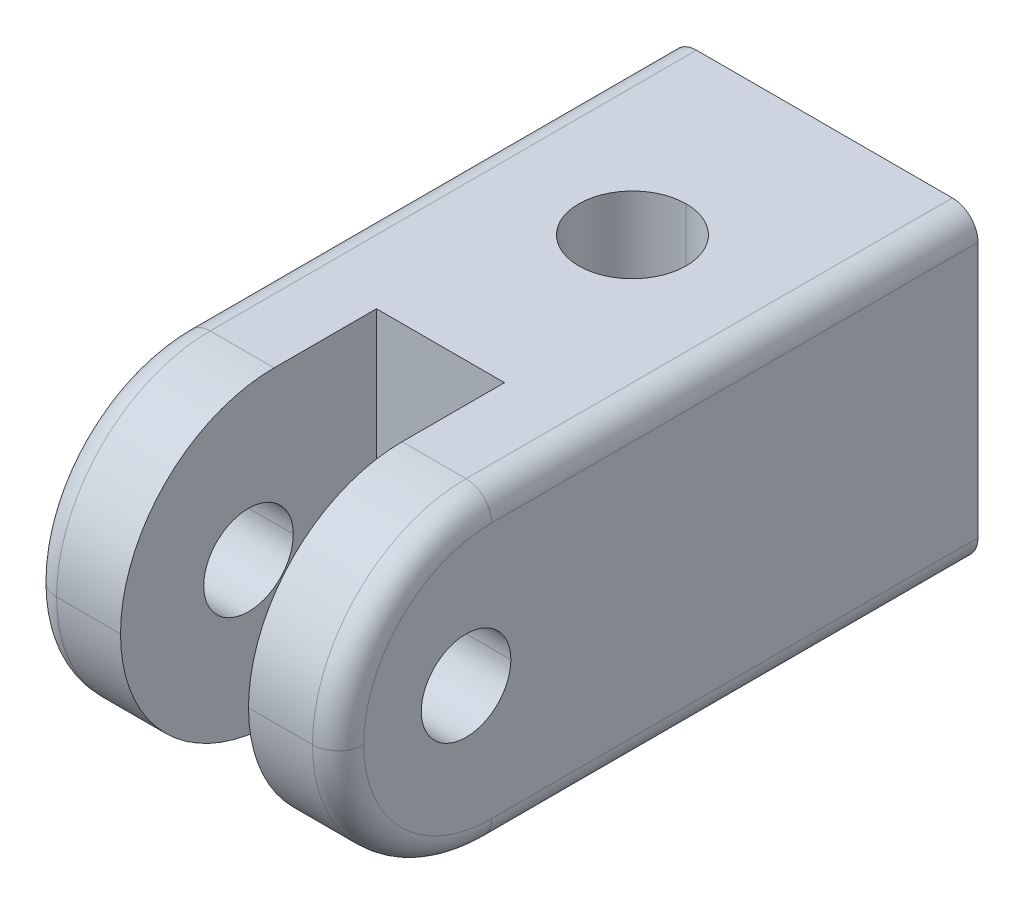
ISO-10303-21;
HEADER;
FILE_DESCRIPTION(('STEP AP214'),'2;1');
FILE_NAME('part.step','',(''),(''),'','','');
FILE_SCHEMA(('AUTOMOTIVE_DESIGN { 1 0 10303 214 1 1 1 1 }'));
ENDSEC;
DATA;
#1=APPLICATION_CONTEXT('core data for automotive mechanical design processes');
#2=APPLICATION_PROTOCOL_DEFINITION('international standard','automotive_design',2000,#1);
#3=PRODUCT_CONTEXT('',#1,'mechanical');
#4=PRODUCT('Part','Part','',(#3));
#5=PRODUCT_RELATED_PRODUCT_CATEGORY('part','',(#4));
#6=PRODUCT_DEFINITION_FORMATION('','',#4);
#7=PRODUCT_DEFINITION_CONTEXT('part definition',#1,'design');
#8=PRODUCT_DEFINITION('design','',#6,#7);
#9=PRODUCT_DEFINITION_SHAPE('','',#8);
#10=(LENGTH_UNIT() NAMED_UNIT(*) SI_UNIT(.MILLI.,.METRE.));
#11=(NAMED_UNIT(*) PLANE_ANGLE_UNIT() SI_UNIT($,.RADIAN.));
#12=(NAMED_UNIT(*) SI_UNIT($,.STERADIAN.) SOLID_ANGLE_UNIT());
#13=UNCERTAINTY_MEASURE_WITH_UNIT(LENGTH_MEASURE(1.E-05),#10,'distance_accuracy_value','');
#14=(GEOMETRIC_REPRESENTATION_CONTEXT(3) GLOBAL_UNCERTAINTY_ASSIGNED_CONTEXT((#13)) GLOBAL_UNIT_ASSIGNED_CONTEXT((#10,
#11,#12)) REPRESENTATION_CONTEXT('',''));
#15=CARTESIAN_POINT('',(0.,0.,0.));
#16=DIRECTION('',(0.,0.,1.));
#17=DIRECTION('',(1.,0.,0.));
#18=AXIS2_PLACEMENT_3D('',#15,#16,#17);
#19=CARTESIAN_POINT('',(11.,11.,0.));
#20=DIRECTION('',(0.,0.,-1.));
#21=DIRECTION('',(-1.,0.,0.));
#22=AXIS2_PLACEMENT_3D('',#19,#20,#21);
#23=CYLINDRICAL_SURFACE('',#22,1.);
#24=CARTESIAN_POINT('',(11.,11.,-6.));
#25=DIRECTION('',(0.,0.,-1.));
#26=DIRECTION('',(-1.,0.,0.));
#27=AXIS2_PLACEMENT_3D('',#24,#25,#26);
#28=CIRCLE('',#27,1.);
#29=CARTESIAN_POINT('',(11.,12.,-6.));
#30=VERTEX_POINT('',#29);
#31=CARTESIAN_POINT('',(12.,11.,-6.));
#32=VERTEX_POINT('',#31);
#33=EDGE_CURVE('E10',#30,#32,#28,.T.);
#34=ORIENTED_EDGE('',*,*,#33,.T.);
#35=DIRECTION('',(0.,0.,1.));
#36=VECTOR('',#35,1.);
#37=CARTESIAN_POINT('',(12.,11.,0.));
#38=LINE('',#37,#36);
#39=CARTESIAN_POINT('',(12.,11.,-25.));
#40=VERTEX_POINT('',#39);
#41=EDGE_CURVE('E337',#40,#32,#38,.T.);
#42=ORIENTED_EDGE('',*,*,#41,.F.);
#43=CARTESIAN_POINT('',(11.,11.,-25.));
#44=DIRECTION('',(0.,0.,-1.));
#45=DIRECTION('',(1.,0.,0.));
#46=AXIS2_PLACEMENT_3D('',#43,#44,#45);
#47=CIRCLE('',#46,1.);
#48=CARTESIAN_POINT('',(11.,12.,-25.));
#49=VERTEX_POINT('',#48);
#50=EDGE_CURVE('E376',#49,#40,#47,.T.);
#51=ORIENTED_EDGE('',*,*,#50,.F.);
#52=DIRECTION('',(0.,0.,-1.));
#53=VECTOR('',#52,1.);
#54=CARTESIAN_POINT('',(11.,12.,0.));
#55=LINE('',#54,#53);
#56=EDGE_CURVE('E222',#30,#49,#55,.T.);
#57=ORIENTED_EDGE('',*,*,#56,.F.);
#58=EDGE_LOOP('',(#34,#42,#51,#57));
#59=FACE_BOUND('',#58,.T.);
#60=ADVANCED_FACE('F16',(#59),#23,.T.);
#61=CARTESIAN_POINT('',(11.,6.,-6.));
#62=DIRECTION('',(-1.,0.,0.));
#63=DIRECTION('',(0.,0.,1.));
#64=AXIS2_PLACEMENT_3D('',#61,#62,#63);
#65=TOROIDAL_SURFACE('',#64,5.,1.);
#66=CARTESIAN_POINT('',(11.,6.,-1.));
#67=DIRECTION('',(0.,1.,0.));
#68=DIRECTION('',(0.,0.,1.));
#69=AXIS2_PLACEMENT_3D('',#66,#67,#68);
#70=CIRCLE('',#69,1.);
#71=CARTESIAN_POINT('',(11.,6.,0.));
#72=VERTEX_POINT('',#71);
#73=CARTESIAN_POINT('',(12.,6.,-1.));
#74=VERTEX_POINT('',#73);
#75=EDGE_CURVE('E24',#72,#74,#70,.T.);
#76=ORIENTED_EDGE('',*,*,#75,.T.);
#77=CARTESIAN_POINT('',(12.,6.,-6.));
#78=DIRECTION('',(1.,0.,0.));
#79=DIRECTION('',(0.,0.,1.));
#80=AXIS2_PLACEMENT_3D('',#77,#78,#79);
#81=CIRCLE('',#80,5.);
#82=EDGE_CURVE('E341',#32,#74,#81,.T.);
#83=ORIENTED_EDGE('',*,*,#82,.F.);
#84=ORIENTED_EDGE('',*,*,#33,.F.);
#85=CARTESIAN_POINT('',(11.,6.,-6.));
#86=DIRECTION('',(-1.,0.,0.));
#87=DIRECTION('',(0.,0.,1.));
#88=AXIS2_PLACEMENT_3D('',#85,#86,#87);
#89=CIRCLE('',#88,6.);
#90=EDGE_CURVE('E388',#72,#30,#89,.T.);
#91=ORIENTED_EDGE('',*,*,#90,.F.);
#92=EDGE_LOOP('',(#76,#83,#84,#91));
#93=FACE_BOUND('',#92,.T.);
#94=ADVANCED_FACE('F459',(#93),#65,.T.);
#95=CARTESIAN_POINT('',(11.,6.,-6.));
#96=DIRECTION('',(-1.,0.,0.));
#97=DIRECTION('',(0.,0.,1.));
#98=AXIS2_PLACEMENT_3D('',#95,#96,#97);
#99=TOROIDAL_SURFACE('',#98,5.,1.);
#100=CARTESIAN_POINT('',(11.,1.,-6.));
#101=DIRECTION('',(0.,0.,1.));
#102=DIRECTION('',(1.,0.,0.));
#103=AXIS2_PLACEMENT_3D('',#100,#101,#102);
#104=CIRCLE('',#103,1.);
#105=CARTESIAN_POINT('',(11.,0.,-6.));
#106=VERTEX_POINT('',#105);
#107=CARTESIAN_POINT('',(12.,1.,-6.));
#108=VERTEX_POINT('',#107);
#109=EDGE_CURVE('E327',#106,#108,#104,.T.);
#110=ORIENTED_EDGE('',*,*,#109,.T.);
#111=CARTESIAN_POINT('',(12.,6.,-6.));
#112=DIRECTION('',(1.,0.,0.));
#113=DIRECTION('',(0.,0.,1.));
#114=AXIS2_PLACEMENT_3D('',#111,#112,#113);
#115=CIRCLE('',#114,5.);
#116=EDGE_CURVE('E319',#74,#108,#115,.T.);
#117=ORIENTED_EDGE('',*,*,#116,.F.);
#118=ORIENTED_EDGE('',*,*,#75,.F.);
#119=CARTESIAN_POINT('',(11.,6.,-6.));
#120=DIRECTION('',(-1.,0.,0.));
#121=DIRECTION('',(0.,0.,1.));
#122=AXIS2_PLACEMENT_3D('',#119,#120,#121);
#123=CIRCLE('',#122,6.);
#124=EDGE_CURVE('E299',#106,#72,#123,.T.);
#125=ORIENTED_EDGE('',*,*,#124,.F.);
#126=EDGE_LOOP('',(#110,#117,#118,#125));
#127=FACE_BOUND('',#126,.T.);
#128=ADVANCED_FACE('F460',(#127),#99,.T.);
#129=CARTESIAN_POINT('',(11.,1.,0.));
#130=DIRECTION('',(0.,0.,1.));
#131=DIRECTION('',(1.,0.,0.));
#132=AXIS2_PLACEMENT_3D('',#129,#130,#131);
#133=CYLINDRICAL_SURFACE('',#132,1.);
#134=CARTESIAN_POINT('',(11.,1.,-25.));
#135=DIRECTION('',(0.,0.,-1.));
#136=DIRECTION('',(1.,0.,0.));
#137=AXIS2_PLACEMENT_3D('',#134,#135,#136);
#138=CIRCLE('',#137,1.);
#139=CARTESIAN_POINT('',(12.,1.,-25.));
#140=VERTEX_POINT('',#139);
#141=CARTESIAN_POINT('',(11.,0.,-25.));
#142=VERTEX_POINT('',#141);
#143=EDGE_CURVE('E380',#140,#142,#138,.T.);
#144=ORIENTED_EDGE('',*,*,#143,.F.);
#145=DIRECTION('',(0.,0.,-1.));
#146=VECTOR('',#145,1.);
#147=CARTESIAN_POINT('',(12.,1.,-25.));
#148=LINE('',#147,#146);
#149=EDGE_CURVE('E314',#108,#140,#148,.T.);
#150=ORIENTED_EDGE('',*,*,#149,.F.);
#151=ORIENTED_EDGE('',*,*,#109,.F.);
#152=DIRECTION('',(0.,0.,1.));
#153=VECTOR('',#152,1.);
#154=CARTESIAN_POINT('',(11.,0.,-6.));
#155=LINE('',#154,#153);
#156=EDGE_CURVE('E295',#142,#106,#155,.T.);
#157=ORIENTED_EDGE('',*,*,#156,.F.);
#158=EDGE_LOOP('',(#144,#150,#151,#157));
#159=FACE_BOUND('',#158,.T.);
#160=ADVANCED_FACE('F483',(#159),#133,.T.);
#161=CARTESIAN_POINT('',(1.,11.,0.));
#162=DIRECTION('',(0.,0.,1.));
#163=DIRECTION('',(1.,0.,0.));
#164=AXIS2_PLACEMENT_3D('',#161,#162,#163);
#165=CYLINDRICAL_SURFACE('',#164,1.);
#166=CARTESIAN_POINT('',(1.,11.,-25.));
#167=DIRECTION('',(0.,0.,-1.));
#168=DIRECTION('',(1.,0.,0.));
#169=AXIS2_PLACEMENT_3D('',#166,#167,#168);
#170=CIRCLE('',#169,1.);
#171=CARTESIAN_POINT('',(0.,11.,-25.));
#172=VERTEX_POINT('',#171);
#173=CARTESIAN_POINT('',(1.,12.,-25.));
#174=VERTEX_POINT('',#173);
#175=EDGE_CURVE('E356',#172,#174,#170,.T.);
#176=ORIENTED_EDGE('',*,*,#175,.F.);
#177=DIRECTION('',(0.,0.,-1.));
#178=VECTOR('',#177,1.);
#179=CARTESIAN_POINT('',(0.,11.,0.));
#180=LINE('',#179,#178);
#181=CARTESIAN_POINT('',(0.,11.,-6.));
#182=VERTEX_POINT('',#181);
#183=EDGE_CURVE('E273',#182,#172,#180,.T.);
#184=ORIENTED_EDGE('',*,*,#183,.F.);
#185=CARTESIAN_POINT('',(1.,11.,-6.));
#186=DIRECTION('',(0.,0.,-1.));
#187=DIRECTION('',(-1.,0.,0.));
#188=AXIS2_PLACEMENT_3D('',#185,#186,#187);
#189=CIRCLE('',#188,1.);
#190=CARTESIAN_POINT('',(1.,12.,-6.));
#191=VERTEX_POINT('',#190);
#192=EDGE_CURVE('E330',#182,#191,#189,.T.);
#193=ORIENTED_EDGE('',*,*,#192,.T.);
#194=DIRECTION('',(0.,0.,1.));
#195=VECTOR('',#194,1.);
#196=CARTESIAN_POINT('',(1.,12.,0.));
#197=LINE('',#196,#195);
#198=EDGE_CURVE('E313',#174,#191,#197,.T.);
#199=ORIENTED_EDGE('',*,*,#198,.F.);
#200=EDGE_LOOP('',(#176,#184,#193,#199));
#201=FACE_BOUND('',#200,.T.);
#202=ADVANCED_FACE('F512',(#201),#165,.T.);
#203=CARTESIAN_POINT('',(1.,6.,-6.));
#204=DIRECTION('',(1.,0.,0.));
#205=DIRECTION('',(0.,0.,-1.));
#206=AXIS2_PLACEMENT_3D('',#203,#204,#205);
#207=TOROIDAL_SURFACE('',#206,5.,1.);
#208=CARTESIAN_POINT('',(1.,6.,-1.));
#209=DIRECTION('',(0.,1.,0.));
#210=DIRECTION('',(0.,0.,1.));
#211=AXIS2_PLACEMENT_3D('',#208,#209,#210);
#212=CIRCLE('',#211,1.);
#213=CARTESIAN_POINT('',(0.,6.,-1.));
#214=VERTEX_POINT('',#213);
#215=CARTESIAN_POINT('',(1.,6.,0.));
#216=VERTEX_POINT('',#215);
#217=EDGE_CURVE('E47',#214,#216,#212,.T.);
#218=ORIENTED_EDGE('',*,*,#217,.T.);
#219=CARTESIAN_POINT('',(1.,6.,-6.));
#220=DIRECTION('',(1.,0.,0.));
#221=DIRECTION('',(0.,0.,-1.));
#222=AXIS2_PLACEMENT_3D('',#219,#220,#221);
#223=CIRCLE('',#222,6.);
#224=EDGE_CURVE('E304',#191,#216,#223,.T.);
#225=ORIENTED_EDGE('',*,*,#224,.F.);
#226=ORIENTED_EDGE('',*,*,#192,.F.);
#227=CARTESIAN_POINT('',(0.,6.,-6.));
#228=DIRECTION('',(-1.,0.,0.));
#229=DIRECTION('',(0.,0.,-1.));
#230=AXIS2_PLACEMENT_3D('',#227,#228,#229);
#231=CIRCLE('',#230,5.);
#232=EDGE_CURVE('E278',#214,#182,#231,.T.);
#233=ORIENTED_EDGE('',*,*,#232,.F.);
#234=EDGE_LOOP('',(#218,#225,#226,#233));
#235=FACE_BOUND('',#234,.T.);
#236=ADVANCED_FACE('F514',(#235),#207,.T.);
#237=CARTESIAN_POINT('',(1.,6.,-6.));
#238=DIRECTION('',(1.,0.,0.));
#239=DIRECTION('',(0.,0.,-1.));
#240=AXIS2_PLACEMENT_3D('',#237,#238,#239);
#241=TOROIDAL_SURFACE('',#240,5.,1.);
#242=CARTESIAN_POINT('',(1.,1.,-6.));
#243=DIRECTION('',(0.,0.,1.));
#244=DIRECTION('',(1.,0.,0.));
#245=AXIS2_PLACEMENT_3D('',#242,#243,#244);
#246=CIRCLE('',#245,1.);
#247=CARTESIAN_POINT('',(0.,1.,-6.));
#248=VERTEX_POINT('',#247);
#249=CARTESIAN_POINT('',(1.,0.,-6.));
#250=VERTEX_POINT('',#249);
#251=EDGE_CURVE('E333',#248,#250,#246,.T.);
#252=ORIENTED_EDGE('',*,*,#251,.T.);
#253=CARTESIAN_POINT('',(1.,6.,-6.));
#254=DIRECTION('',(1.,0.,0.));
#255=DIRECTION('',(0.,0.,-1.));
#256=AXIS2_PLACEMENT_3D('',#253,#254,#255);
#257=CIRCLE('',#256,6.);
#258=EDGE_CURVE('E442',#216,#250,#257,.T.);
#259=ORIENTED_EDGE('',*,*,#258,.F.);
#260=ORIENTED_EDGE('',*,*,#217,.F.);
#261=CARTESIAN_POINT('',(0.,6.,-6.));
#262=DIRECTION('',(-1.,0.,0.));
#263=DIRECTION('',(0.,0.,-1.));
#264=AXIS2_PLACEMENT_3D('',#261,#262,#263);
#265=CIRCLE('',#264,5.);
#266=EDGE_CURVE('E308',#248,#214,#265,.T.);
#267=ORIENTED_EDGE('',*,*,#266,.F.);
#268=EDGE_LOOP('',(#252,#259,#260,#267));
#269=FACE_BOUND('',#268,.T.);
#270=ADVANCED_FACE('F543',(#269),#241,.T.);
#271=CARTESIAN_POINT('',(1.,1.,0.));
#272=DIRECTION('',(0.,0.,-1.));
#273=DIRECTION('',(-1.,0.,0.));
#274=AXIS2_PLACEMENT_3D('',#271,#272,#273);
#275=CYLINDRICAL_SURFACE('',#274,1.);
#276=CARTESIAN_POINT('',(1.,1.,-25.));
#277=DIRECTION('',(0.,0.,-1.));
#278=DIRECTION('',(1.,0.,0.));
#279=AXIS2_PLACEMENT_3D('',#276,#277,#278);
#280=CIRCLE('',#279,1.);
#281=CARTESIAN_POINT('',(1.,0.,-25.));
#282=VERTEX_POINT('',#281);
#283=CARTESIAN_POINT('',(0.,1.,-25.));
#284=VERTEX_POINT('',#283);
#285=EDGE_CURVE('E392',#282,#284,#280,.T.);
#286=ORIENTED_EDGE('',*,*,#285,.F.);
#287=DIRECTION('',(0.,0.,-1.));
#288=VECTOR('',#287,1.);
#289=CARTESIAN_POINT('',(1.,0.,-25.));
#290=LINE('',#289,#288);
#291=EDGE_CURVE('E292',#250,#282,#290,.T.);
#292=ORIENTED_EDGE('',*,*,#291,.F.);
#293=ORIENTED_EDGE('',*,*,#251,.F.);
#294=DIRECTION('',(0.,0.,1.));
#295=VECTOR('',#294,1.);
#296=CARTESIAN_POINT('',(0.,1.,-6.));
#297=LINE('',#296,#295);
#298=EDGE_CURVE('E272',#284,#248,#297,.T.);
#299=ORIENTED_EDGE('',*,*,#298,.F.);
#300=EDGE_LOOP('',(#286,#292,#293,#299));
#301=FACE_BOUND('',#300,.T.);
#302=ADVANCED_FACE('F507',(#301),#275,.T.);
#303=CARTESIAN_POINT('',(6.,12.001,-17.5));
#304=DIRECTION('',(0.,-1.,0.));
#305=DIRECTION('',(0.,0.,-1.));
#306=AXIS2_PLACEMENT_3D('',#303,#304,#305);
#307=CYLINDRICAL_SURFACE('',#306,2.1);
#308=DIRECTION('',(0.,-1.,0.));
#309=VECTOR('',#308,1.);
#310=CARTESIAN_POINT('',(6.,12.001,-15.4));
#311=LINE('',#310,#309);
#312=CARTESIAN_POINT('',(6.,12.,-15.4));
#313=VERTEX_POINT('',#312);
#314=CARTESIAN_POINT('',(6.,0.,-15.4));
#315=VERTEX_POINT('',#314);
#316=EDGE_CURVE('E216',#313,#315,#311,.T.);
#317=ORIENTED_EDGE('',*,*,#316,.F.);
#318=CARTESIAN_POINT('',(6.,12.,-17.5));
#319=DIRECTION('',(0.,1.,0.));
#320=DIRECTION('',(0.,0.,-1.));
#321=AXIS2_PLACEMENT_3D('',#318,#319,#320);
#322=CIRCLE('',#321,2.1);
#323=CARTESIAN_POINT('',(6.,12.,-19.6));
#324=VERTEX_POINT('',#323);
#325=EDGE_CURVE('E210',#313,#324,#322,.T.);
#326=ORIENTED_EDGE('',*,*,#325,.T.);
#327=DIRECTION('',(0.,-1.,0.));
#328=VECTOR('',#327,1.);
#329=CARTESIAN_POINT('',(6.,12.001,-19.6));
#330=LINE('',#329,#328);
#331=CARTESIAN_POINT('',(6.,0.,-19.6));
#332=VERTEX_POINT('',#331);
#333=EDGE_CURVE('E213',#324,#332,#330,.T.);
#334=ORIENTED_EDGE('',*,*,#333,.T.);
#335=CARTESIAN_POINT('',(6.,0.,-17.5));
#336=DIRECTION('',(0.,-1.,0.));
#337=DIRECTION('',(0.,0.,-1.));
#338=AXIS2_PLACEMENT_3D('',#335,#336,#337);
#339=CIRCLE('',#338,2.1);
#340=EDGE_CURVE('E423',#332,#315,#339,.T.);
#341=ORIENTED_EDGE('',*,*,#340,.T.);
#342=EDGE_LOOP('',(#317,#326,#334,#341));
#343=FACE_BOUND('',#342,.T.);
#344=ADVANCED_FACE('F212',(#343),#307,.F.);
#345=CARTESIAN_POINT('',(0.,6.,-6.));
#346=DIRECTION('',(1.,0.,0.));
#347=DIRECTION('',(0.,0.,-1.));
#348=AXIS2_PLACEMENT_3D('',#345,#346,#347);
#349=CYLINDRICAL_SURFACE('',#348,6.);
#350=DIRECTION('',(1.,0.,0.));
#351=VECTOR('',#350,1.);
#352=CARTESIAN_POINT('',(12.,6.,0.));
#353=LINE('',#352,#351);
#354=CARTESIAN_POINT('',(8.5,6.,0.));
#355=VERTEX_POINT('',#354);
#356=EDGE_CURVE('E303',#355,#72,#353,.T.);
#357=ORIENTED_EDGE('',*,*,#356,.T.);
#358=ORIENTED_EDGE('',*,*,#90,.T.);
#359=DIRECTION('',(1.,0.,0.));
#360=VECTOR('',#359,1.);
#361=CARTESIAN_POINT('',(0.,12.,-6.));
#362=LINE('',#361,#360);
#363=CARTESIAN_POINT('',(8.5,12.,-6.));
#364=VERTEX_POINT('',#363);
#365=EDGE_CURVE('E258',#364,#30,#362,.T.);
#366=ORIENTED_EDGE('',*,*,#365,.F.);
#367=CARTESIAN_POINT('',(8.5,6.,-6.));
#368=DIRECTION('',(-1.,0.,0.));
#369=DIRECTION('',(0.,0.,-1.));
#370=AXIS2_PLACEMENT_3D('',#367,#368,#369);
#371=CIRCLE('',#370,6.);
#372=EDGE_CURVE('E349',#355,#364,#371,.T.);
#373=ORIENTED_EDGE('',*,*,#372,.F.);
#374=EDGE_LOOP('',(#357,#358,#366,#373));
#375=FACE_BOUND('',#374,.T.);
#376=ADVANCED_FACE('F472',(#375),#349,.T.);
#377=CARTESIAN_POINT('',(0.,6.,-6.));
#378=DIRECTION('',(-1.,0.,0.));
#379=DIRECTION('',(0.,0.,1.));
#380=AXIS2_PLACEMENT_3D('',#377,#378,#379);
#381=CYLINDRICAL_SURFACE('',#380,6.);
#382=DIRECTION('',(-1.,0.,0.));
#383=VECTOR('',#382,1.);
#384=CARTESIAN_POINT('',(8.5,0.,-6.));
#385=LINE('',#384,#383);
#386=CARTESIAN_POINT('',(8.5,0.,-6.));
#387=VERTEX_POINT('',#386);
#388=EDGE_CURVE('E410',#106,#387,#385,.T.);
#389=ORIENTED_EDGE('',*,*,#388,.F.);
#390=ORIENTED_EDGE('',*,*,#124,.T.);
#391=ORIENTED_EDGE('',*,*,#356,.F.);
#392=CARTESIAN_POINT('',(8.5,6.,-6.));
#393=DIRECTION('',(-1.,0.,0.));
#394=DIRECTION('',(0.,0.,-1.));
#395=AXIS2_PLACEMENT_3D('',#392,#393,#394);
#396=CIRCLE('',#395,6.);
#397=EDGE_CURVE('E345',#387,#355,#396,.T.);
#398=ORIENTED_EDGE('',*,*,#397,.F.);
#399=EDGE_LOOP('',(#389,#390,#391,#398));
#400=FACE_BOUND('',#399,.T.);
#401=ADVANCED_FACE('F477',(#400),#381,.T.);
#402=CARTESIAN_POINT('',(0.,6.,-6.));
#403=DIRECTION('',(1.,0.,0.));
#404=DIRECTION('',(0.,0.,-1.));
#405=AXIS2_PLACEMENT_3D('',#402,#403,#404);
#406=CYLINDRICAL_SURFACE('',#405,6.);
#407=DIRECTION('',(1.,0.,0.));
#408=VECTOR('',#407,1.);
#409=CARTESIAN_POINT('',(0.,12.,-6.));
#410=LINE('',#409,#408);
#411=CARTESIAN_POINT('',(3.5,12.,-6.));
#412=VERTEX_POINT('',#411);
#413=EDGE_CURVE('E309',#191,#412,#410,.T.);
#414=ORIENTED_EDGE('',*,*,#413,.F.);
#415=ORIENTED_EDGE('',*,*,#224,.T.);
#416=DIRECTION('',(1.,0.,0.));
#417=VECTOR('',#416,1.);
#418=CARTESIAN_POINT('',(3.5,6.,0.));
#419=LINE('',#418,#417);
#420=CARTESIAN_POINT('',(3.5,6.,0.));
#421=VERTEX_POINT('',#420);
#422=EDGE_CURVE('E446',#216,#421,#419,.T.);
#423=ORIENTED_EDGE('',*,*,#422,.T.);
#424=CARTESIAN_POINT('',(3.5,6.,-6.));
#425=DIRECTION('',(1.,0.,0.));
#426=DIRECTION('',(0.,0.,1.));
#427=AXIS2_PLACEMENT_3D('',#424,#425,#426);
#428=CIRCLE('',#427,6.);
#429=EDGE_CURVE('E373',#412,#421,#428,.T.);
#430=ORIENTED_EDGE('',*,*,#429,.F.);
#431=EDGE_LOOP('',(#414,#415,#423,#430));
#432=FACE_BOUND('',#431,.T.);
#433=ADVANCED_FACE('F516',(#432),#406,.T.);
#434=CARTESIAN_POINT('',(0.,6.,-6.));
#435=DIRECTION('',(-1.,0.,0.));
#436=DIRECTION('',(0.,0.,1.));
#437=AXIS2_PLACEMENT_3D('',#434,#435,#436);
#438=CYLINDRICAL_SURFACE('',#437,6.);
#439=ORIENTED_EDGE('',*,*,#422,.F.);
#440=ORIENTED_EDGE('',*,*,#258,.T.);
#441=DIRECTION('',(-1.,0.,0.));
#442=VECTOR('',#441,1.);
#443=CARTESIAN_POINT('',(0.,0.,-6.));
#444=LINE('',#443,#442);
#445=CARTESIAN_POINT('',(3.5,0.,-6.));
#446=VERTEX_POINT('',#445);
#447=EDGE_CURVE('E221',#446,#250,#444,.T.);
#448=ORIENTED_EDGE('',*,*,#447,.F.);
#449=CARTESIAN_POINT('',(3.5,6.,-6.));
#450=DIRECTION('',(1.,0.,0.));
#451=DIRECTION('',(0.,0.,1.));
#452=AXIS2_PLACEMENT_3D('',#449,#450,#451);
#453=CIRCLE('',#452,6.);
#454=EDGE_CURVE('E369',#421,#446,#453,.T.);
#455=ORIENTED_EDGE('',*,*,#454,.F.);
#456=EDGE_LOOP('',(#439,#440,#448,#455));
#457=FACE_BOUND('',#456,.T.);
#458=ADVANCED_FACE('F501',(#457),#438,.T.);
#459=CARTESIAN_POINT('',(0.,6.,-5.));
#460=DIRECTION('',(1.,0.,0.));
#461=DIRECTION('',(0.,0.,-1.));
#462=AXIS2_PLACEMENT_3D('',#459,#460,#461);
#463=CYLINDRICAL_SURFACE('',#462,1.75);
#464=DIRECTION('',(1.,0.,0.));
#465=VECTOR('',#464,1.);
#466=CARTESIAN_POINT('',(0.,6.,-3.25));
#467=LINE('',#466,#465);
#468=CARTESIAN_POINT('',(0.,6.,-3.25));
#469=VERTEX_POINT('',#468);
#470=CARTESIAN_POINT('',(3.5,6.,-3.25));
#471=VERTEX_POINT('',#470);
#472=EDGE_CURVE('E248',#469,#471,#467,.T.);
#473=ORIENTED_EDGE('',*,*,#472,.F.);
#474=CARTESIAN_POINT('',(0.,6.,-5.));
#475=DIRECTION('',(1.,0.,0.));
#476=DIRECTION('',(0.,0.,-1.));
#477=AXIS2_PLACEMENT_3D('',#474,#475,#476);
#478=CIRCLE('',#477,1.75);
#479=CARTESIAN_POINT('',(0.,6.,-6.75));
#480=VERTEX_POINT('',#479);
#481=EDGE_CURVE('E323',#480,#469,#478,.T.);
#482=ORIENTED_EDGE('',*,*,#481,.F.);
#483=DIRECTION('',(1.,0.,0.));
#484=VECTOR('',#483,1.);
#485=CARTESIAN_POINT('',(0.,6.,-6.75));
#486=LINE('',#485,#484);
#487=CARTESIAN_POINT('',(3.5,6.,-6.75));
#488=VERTEX_POINT('',#487);
#489=EDGE_CURVE('E247',#480,#488,#486,.T.);
#490=ORIENTED_EDGE('',*,*,#489,.T.);
#491=CARTESIAN_POINT('',(3.5,6.,-5.));
#492=DIRECTION('',(-1.,0.,0.));
#493=DIRECTION('',(0.,0.,1.));
#494=AXIS2_PLACEMENT_3D('',#491,#492,#493);
#495=CIRCLE('',#494,1.75);
#496=EDGE_CURVE('E434',#471,#488,#495,.T.);
#497=ORIENTED_EDGE('',*,*,#496,.F.);
#498=EDGE_LOOP('',(#473,#482,#490,#497));
#499=FACE_BOUND('',#498,.T.);
#500=ADVANCED_FACE('F524',(#499),#463,.F.);
#501=CARTESIAN_POINT('',(0.,6.,-5.));
#502=DIRECTION('',(1.,0.,0.));
#503=DIRECTION('',(0.,0.,-1.));
#504=AXIS2_PLACEMENT_3D('',#501,#502,#503);
#505=CYLINDRICAL_SURFACE('',#504,1.75);
#506=DIRECTION('',(1.,0.,0.));
#507=VECTOR('',#506,1.);
#508=CARTESIAN_POINT('',(0.,6.,-3.25));
#509=LINE('',#508,#507);
#510=CARTESIAN_POINT('',(8.5,6.,-3.25));
#511=VERTEX_POINT('',#510);
#512=CARTESIAN_POINT('',(12.,6.,-3.25));
#513=VERTEX_POINT('',#512);
#514=EDGE_CURVE('E255',#511,#513,#509,.T.);
#515=ORIENTED_EDGE('',*,*,#514,.F.);
#516=CARTESIAN_POINT('',(8.5,6.,-5.));
#517=DIRECTION('',(1.,0.,0.));
#518=DIRECTION('',(0.,0.,-1.));
#519=AXIS2_PLACEMENT_3D('',#516,#517,#518);
#520=CIRCLE('',#519,1.75);
#521=CARTESIAN_POINT('',(8.5,6.,-6.75));
#522=VERTEX_POINT('',#521);
#523=EDGE_CURVE('E441',#522,#511,#520,.T.);
#524=ORIENTED_EDGE('',*,*,#523,.F.);
#525=DIRECTION('',(1.,0.,0.));
#526=VECTOR('',#525,1.);
#527=CARTESIAN_POINT('',(0.,6.,-6.75));
#528=LINE('',#527,#526);
#529=CARTESIAN_POINT('',(12.,6.,-6.75));
#530=VERTEX_POINT('',#529);
#531=EDGE_CURVE('E274',#522,#530,#528,.T.);
#532=ORIENTED_EDGE('',*,*,#531,.T.);
#533=CARTESIAN_POINT('',(12.,6.,-5.));
#534=DIRECTION('',(1.,0.,0.));
#535=DIRECTION('',(0.,0.,-1.));
#536=AXIS2_PLACEMENT_3D('',#533,#534,#535);
#537=CIRCLE('',#536,1.75);
#538=EDGE_CURVE('E318',#530,#513,#537,.T.);
#539=ORIENTED_EDGE('',*,*,#538,.T.);
#540=EDGE_LOOP('',(#515,#524,#532,#539));
#541=FACE_BOUND('',#540,.T.);
#542=ADVANCED_FACE('F551',(#541),#505,.F.);
#543=CARTESIAN_POINT('',(8.5,-0.000999999999999265,0.));
#544=DIRECTION('',(1.,0.,0.));
#545=DIRECTION('',(0.,0.,-1.));
#546=AXIS2_PLACEMENT_3D('',#543,#544,#545);
#547=PLANE('',#546);
#548=ORIENTED_EDGE('',*,*,#523,.T.);
#549=CARTESIAN_POINT('',(8.5,6.,-5.));
#550=DIRECTION('',(1.,0.,0.));
#551=DIRECTION('',(0.,0.,-1.));
#552=AXIS2_PLACEMENT_3D('',#549,#550,#551);
#553=CIRCLE('',#552,1.75);
#554=EDGE_CURVE('E251',#511,#522,#553,.T.);
#555=ORIENTED_EDGE('',*,*,#554,.T.);
#556=EDGE_LOOP('',(#548,#555));
#557=FACE_BOUND('',#556,.T.);
#558=ORIENTED_EDGE('',*,*,#397,.T.);
#559=ORIENTED_EDGE('',*,*,#372,.T.);
#560=DIRECTION('',(0.,0.,-1.));
#561=VECTOR('',#560,1.);
#562=CARTESIAN_POINT('',(8.5,12.,0.));
#563=LINE('',#562,#561);
#564=CARTESIAN_POINT('',(8.5,12.,-10.));
#565=VERTEX_POINT('',#564);
#566=EDGE_CURVE('E266',#364,#565,#563,.T.);
#567=ORIENTED_EDGE('',*,*,#566,.T.);
#568=DIRECTION('',(0.,1.,0.));
#569=VECTOR('',#568,1.);
#570=CARTESIAN_POINT('',(8.5,-0.000999999999999265,-10.));
#571=LINE('',#570,#569);
#572=CARTESIAN_POINT('',(8.5,0.,-10.));
#573=VERTEX_POINT('',#572);
#574=EDGE_CURVE('E350',#573,#565,#571,.T.);
#575=ORIENTED_EDGE('',*,*,#574,.F.);
#576=DIRECTION('',(0.,0.,-1.));
#577=VECTOR('',#576,1.);
#578=CARTESIAN_POINT('',(8.5,0.,0.));
#579=LINE('',#578,#577);
#580=EDGE_CURVE('E364',#387,#573,#579,.T.);
#581=ORIENTED_EDGE('',*,*,#580,.F.);
#582=EDGE_LOOP('',(#558,#559,#567,#575,#581));
#583=FACE_BOUND('',#582,.T.);
#584=ADVANCED_FACE('F490',(#557,#583),#547,.F.);
#585=CARTESIAN_POINT('',(3.5,-0.000999999999999265,-10.));
#586=DIRECTION('',(0.,0.,-1.));
#587=DIRECTION('',(0.,-1.,0.));
#588=AXIS2_PLACEMENT_3D('',#585,#586,#587);
#589=PLANE('',#588);
#590=ORIENTED_EDGE('',*,*,#574,.T.);
#591=DIRECTION('',(-1.,0.,0.));
#592=VECTOR('',#591,1.);
#593=CARTESIAN_POINT('',(3.5,12.,-10.));
#594=LINE('',#593,#592);
#595=CARTESIAN_POINT('',(3.5,12.,-10.));
#596=VERTEX_POINT('',#595);
#597=EDGE_CURVE('E262',#565,#596,#594,.T.);
#598=ORIENTED_EDGE('',*,*,#597,.T.);
#599=DIRECTION('',(0.,1.,0.));
#600=VECTOR('',#599,1.);
#601=CARTESIAN_POINT('',(3.5,-0.000999999999999265,-10.));
#602=LINE('',#601,#600);
#603=CARTESIAN_POINT('',(3.5,0.,-10.));
#604=VERTEX_POINT('',#603);
#605=EDGE_CURVE('E372',#604,#596,#602,.T.);
#606=ORIENTED_EDGE('',*,*,#605,.F.);
#607=DIRECTION('',(-1.,0.,0.));
#608=VECTOR('',#607,1.);
#609=CARTESIAN_POINT('',(3.5,0.,-10.));
#610=LINE('',#609,#608);
#611=EDGE_CURVE('E359',#573,#604,#610,.T.);
#612=ORIENTED_EDGE('',*,*,#611,.F.);
#613=EDGE_LOOP('',(#590,#598,#606,#612));
#614=FACE_BOUND('',#613,.T.);
#615=ADVANCED_FACE('F495',(#614),#589,.F.);
#616=CARTESIAN_POINT('',(3.5,-0.000999999999999265,0.));
#617=DIRECTION('',(-1.,0.,0.));
#618=DIRECTION('',(0.,0.,1.));
#619=AXIS2_PLACEMENT_3D('',#616,#617,#618);
#620=PLANE('',#619);
#621=CARTESIAN_POINT('',(3.5,6.,-5.));
#622=DIRECTION('',(-1.,0.,0.));
#623=DIRECTION('',(0.,0.,1.));
#624=AXIS2_PLACEMENT_3D('',#621,#622,#623);
#625=CIRCLE('',#624,1.75);
#626=EDGE_CURVE('E243',#488,#471,#625,.T.);
#627=ORIENTED_EDGE('',*,*,#626,.T.);
#628=ORIENTED_EDGE('',*,*,#496,.T.);
#629=EDGE_LOOP('',(#627,#628));
#630=FACE_BOUND('',#629,.T.);
#631=DIRECTION('',(0.,0.,1.));
#632=VECTOR('',#631,1.);
#633=CARTESIAN_POINT('',(3.5,12.,0.));
#634=LINE('',#633,#632);
#635=EDGE_CURVE('E267',#596,#412,#634,.T.);
#636=ORIENTED_EDGE('',*,*,#635,.T.);
#637=ORIENTED_EDGE('',*,*,#429,.T.);
#638=ORIENTED_EDGE('',*,*,#454,.T.);
#639=DIRECTION('',(0.,0.,1.));
#640=VECTOR('',#639,1.);
#641=CARTESIAN_POINT('',(3.5,0.,0.));
#642=LINE('',#641,#640);
#643=EDGE_CURVE('E363',#604,#446,#642,.T.);
#644=ORIENTED_EDGE('',*,*,#643,.F.);
#645=ORIENTED_EDGE('',*,*,#605,.T.);
#646=EDGE_LOOP('',(#636,#637,#638,#644,#645));
#647=FACE_BOUND('',#646,.T.);
#648=ADVANCED_FACE('F497',(#630,#647),#620,.F.);
#649=CARTESIAN_POINT('',(0.,0.,0.));
#650=DIRECTION('',(0.,-1.,0.));
#651=DIRECTION('',(0.,0.,-1.));
#652=AXIS2_PLACEMENT_3D('',#649,#650,#651);
#653=PLANE('',#652);
#654=ORIENTED_EDGE('',*,*,#340,.F.);
#655=CARTESIAN_POINT('',(6.,0.,-17.5));
#656=DIRECTION('',(0.,-1.,0.));
#657=DIRECTION('',(0.,0.,-1.));
#658=AXIS2_PLACEMENT_3D('',#655,#656,#657);
#659=CIRCLE('',#658,2.1);
#660=EDGE_CURVE('E228',#315,#332,#659,.T.);
#661=ORIENTED_EDGE('',*,*,#660,.F.);
#662=EDGE_LOOP('',(#654,#661));
#663=FACE_BOUND('',#662,.T.);
#664=ORIENTED_EDGE('',*,*,#447,.T.);
#665=ORIENTED_EDGE('',*,*,#291,.T.);
#666=DIRECTION('',(-1.,0.,0.));
#667=VECTOR('',#666,1.);
#668=CARTESIAN_POINT('',(0.,0.,-25.));
#669=LINE('',#668,#667);
#670=EDGE_CURVE('E384',#142,#282,#669,.T.);
#671=ORIENTED_EDGE('',*,*,#670,.F.);
#672=ORIENTED_EDGE('',*,*,#156,.T.);
#673=ORIENTED_EDGE('',*,*,#388,.T.);
#674=ORIENTED_EDGE('',*,*,#580,.T.);
#675=ORIENTED_EDGE('',*,*,#611,.T.);
#676=ORIENTED_EDGE('',*,*,#643,.T.);
#677=EDGE_LOOP('',(#664,#665,#671,#672,#673,#674,#675,#676));
#678=FACE_BOUND('',#677,.T.);
#679=ADVANCED_FACE('F481',(#663,#678),#653,.T.);
#680=CARTESIAN_POINT('',(0.,12.,0.));
#681=DIRECTION('',(0.,-1.,0.));
#682=DIRECTION('',(0.,0.,-1.));
#683=AXIS2_PLACEMENT_3D('',#680,#681,#682);
#684=PLANE('',#683);
#685=CARTESIAN_POINT('',(6.,12.,-17.5));
#686=DIRECTION('',(0.,1.,0.));
#687=DIRECTION('',(0.,0.,-1.));
#688=AXIS2_PLACEMENT_3D('',#685,#686,#687);
#689=CIRCLE('',#688,2.1);
#690=EDGE_CURVE('E226',#324,#313,#689,.T.);
#691=ORIENTED_EDGE('',*,*,#690,.F.);
#692=ORIENTED_EDGE('',*,*,#325,.F.);
#693=EDGE_LOOP('',(#691,#692));
#694=FACE_BOUND('',#693,.T.);
#695=DIRECTION('',(-1.,0.,0.));
#696=VECTOR('',#695,1.);
#697=CARTESIAN_POINT('',(0.,12.,-25.));
#698=LINE('',#697,#696);
#699=EDGE_CURVE('E368',#49,#174,#698,.T.);
#700=ORIENTED_EDGE('',*,*,#699,.T.);
#701=ORIENTED_EDGE('',*,*,#198,.T.);
#702=ORIENTED_EDGE('',*,*,#413,.T.);
#703=ORIENTED_EDGE('',*,*,#635,.F.);
#704=ORIENTED_EDGE('',*,*,#597,.F.);
#705=ORIENTED_EDGE('',*,*,#566,.F.);
#706=ORIENTED_EDGE('',*,*,#365,.T.);
#707=ORIENTED_EDGE('',*,*,#56,.T.);
#708=EDGE_LOOP('',(#700,#701,#702,#703,#704,#705,#706,#707));
#709=FACE_BOUND('',#708,.T.);
#710=ADVANCED_FACE('F232',(#694,#709),#684,.F.);
#711=CARTESIAN_POINT('',(0.,12.,-25.));
#712=DIRECTION('',(0.,0.,1.));
#713=DIRECTION('',(1.,0.,0.));
#714=AXIS2_PLACEMENT_3D('',#711,#712,#713);
#715=PLANE('',#714);
#716=DIRECTION('',(0.,-1.,0.));
#717=VECTOR('',#716,1.);
#718=CARTESIAN_POINT('',(0.,12.,-25.));
#719=LINE('',#718,#717);
#720=EDGE_CURVE('E268',#172,#284,#719,.T.);
#721=ORIENTED_EDGE('',*,*,#720,.F.);
#722=ORIENTED_EDGE('',*,*,#175,.T.);
#723=ORIENTED_EDGE('',*,*,#699,.F.);
#724=ORIENTED_EDGE('',*,*,#50,.T.);
#725=DIRECTION('',(0.,-1.,0.));
#726=VECTOR('',#725,1.);
#727=CARTESIAN_POINT('',(12.,12.,-25.));
#728=LINE('',#727,#726);
#729=EDGE_CURVE('E326',#40,#140,#728,.T.);
#730=ORIENTED_EDGE('',*,*,#729,.T.);
#731=ORIENTED_EDGE('',*,*,#143,.T.);
#732=ORIENTED_EDGE('',*,*,#670,.T.);
#733=ORIENTED_EDGE('',*,*,#285,.T.);
#734=EDGE_LOOP('',(#721,#722,#723,#724,#730,#731,#732,#733));
#735=FACE_BOUND('',#734,.T.);
#736=ADVANCED_FACE('F486',(#735),#715,.F.);
#737=CARTESIAN_POINT('',(12.,12.,0.));
#738=DIRECTION('',(-1.,0.,0.));
#739=DIRECTION('',(0.,0.,1.));
#740=AXIS2_PLACEMENT_3D('',#737,#738,#739);
#741=PLANE('',#740);
#742=ORIENTED_EDGE('',*,*,#538,.F.);
#743=CARTESIAN_POINT('',(12.,6.,-5.));
#744=DIRECTION('',(1.,0.,0.));
#745=DIRECTION('',(0.,0.,-1.));
#746=AXIS2_PLACEMENT_3D('',#743,#744,#745);
#747=CIRCLE('',#746,1.75);
#748=EDGE_CURVE('E279',#513,#530,#747,.T.);
#749=ORIENTED_EDGE('',*,*,#748,.F.);
#750=EDGE_LOOP('',(#742,#749));
#751=FACE_BOUND('',#750,.T.);
#752=ORIENTED_EDGE('',*,*,#729,.F.);
#753=ORIENTED_EDGE('',*,*,#41,.T.);
#754=ORIENTED_EDGE('',*,*,#82,.T.);
#755=ORIENTED_EDGE('',*,*,#116,.T.);
#756=ORIENTED_EDGE('',*,*,#149,.T.);
#757=EDGE_LOOP('',(#752,#753,#754,#755,#756));
#758=FACE_BOUND('',#757,.T.);
#759=ADVANCED_FACE('F464',(#751,#758),#741,.F.);
#760=CARTESIAN_POINT('',(0.,12.,0.));
#761=DIRECTION('',(1.,0.,0.));
#762=DIRECTION('',(0.,1.,0.));
#763=AXIS2_PLACEMENT_3D('',#760,#761,#762);
#764=PLANE('',#763);
#765=ORIENTED_EDGE('',*,*,#481,.T.);
#766=CARTESIAN_POINT('',(0.,6.,-5.));
#767=DIRECTION('',(1.,0.,0.));
#768=DIRECTION('',(0.,0.,-1.));
#769=AXIS2_PLACEMENT_3D('',#766,#767,#768);
#770=CIRCLE('',#769,1.75);
#771=EDGE_CURVE('E230',#469,#480,#770,.T.);
#772=ORIENTED_EDGE('',*,*,#771,.T.);
#773=EDGE_LOOP('',(#765,#772));
#774=FACE_BOUND('',#773,.T.);
#775=ORIENTED_EDGE('',*,*,#232,.T.);
#776=ORIENTED_EDGE('',*,*,#183,.T.);
#777=ORIENTED_EDGE('',*,*,#720,.T.);
#778=ORIENTED_EDGE('',*,*,#298,.T.);
#779=ORIENTED_EDGE('',*,*,#266,.T.);
#780=EDGE_LOOP('',(#775,#776,#777,#778,#779));
#781=FACE_BOUND('',#780,.T.);
#782=ADVANCED_FACE('F510',(#774,#781),#764,.F.);
#783=CARTESIAN_POINT('',(0.,6.,-5.));
#784=DIRECTION('',(1.,0.,0.));
#785=DIRECTION('',(0.,0.,-1.));
#786=AXIS2_PLACEMENT_3D('',#783,#784,#785);
#787=CYLINDRICAL_SURFACE('',#786,1.75);
#788=ORIENTED_EDGE('',*,*,#554,.F.);
#789=ORIENTED_EDGE('',*,*,#514,.T.);
#790=ORIENTED_EDGE('',*,*,#748,.T.);
#791=ORIENTED_EDGE('',*,*,#531,.F.);
#792=EDGE_LOOP('',(#788,#789,#790,#791));
#793=FACE_BOUND('',#792,.T.);
#794=ADVANCED_FACE('F578',(#793),#787,.F.);
#795=CARTESIAN_POINT('',(0.,6.,-5.));
#796=DIRECTION('',(1.,0.,0.));
#797=DIRECTION('',(0.,0.,-1.));
#798=AXIS2_PLACEMENT_3D('',#795,#796,#797);
#799=CYLINDRICAL_SURFACE('',#798,1.75);
#800=ORIENTED_EDGE('',*,*,#771,.F.);
#801=ORIENTED_EDGE('',*,*,#472,.T.);
#802=ORIENTED_EDGE('',*,*,#626,.F.);
#803=ORIENTED_EDGE('',*,*,#489,.F.);
#804=EDGE_LOOP('',(#800,#801,#802,#803));
#805=FACE_BOUND('',#804,.T.);
#806=ADVANCED_FACE('F582',(#805),#799,.F.);
#807=CARTESIAN_POINT('',(6.,12.001,-17.5));
#808=DIRECTION('',(0.,-1.,0.));
#809=DIRECTION('',(0.,0.,-1.));
#810=AXIS2_PLACEMENT_3D('',#807,#808,#809);
#811=CYLINDRICAL_SURFACE('',#810,2.1);
#812=ORIENTED_EDGE('',*,*,#690,.T.);
#813=ORIENTED_EDGE('',*,*,#316,.T.);
#814=ORIENTED_EDGE('',*,*,#660,.T.);
#815=ORIENTED_EDGE('',*,*,#333,.F.);
#816=EDGE_LOOP('',(#812,#813,#814,#815));
#817=FACE_BOUND('',#816,.T.);
#818=ADVANCED_FACE('F225',(#817),#811,.F.);
#819=CLOSED_SHELL('',(#60,#94,#128,#160,#202,#236,#270,#302,#344,#376,#401,#433,#458,#500,#542,
#584,#615,#648,#679,#710,#736,#759,#782,#794,#806,#818));
#820=MANIFOLD_SOLID_BREP('B1',#819);
#821=ADVANCED_BREP_SHAPE_REPRESENTATION('',(#18,#820),#14);
#822=SHAPE_DEFINITION_REPRESENTATION(#9,#821);
ENDSEC;
END-ISO-10303-21;
